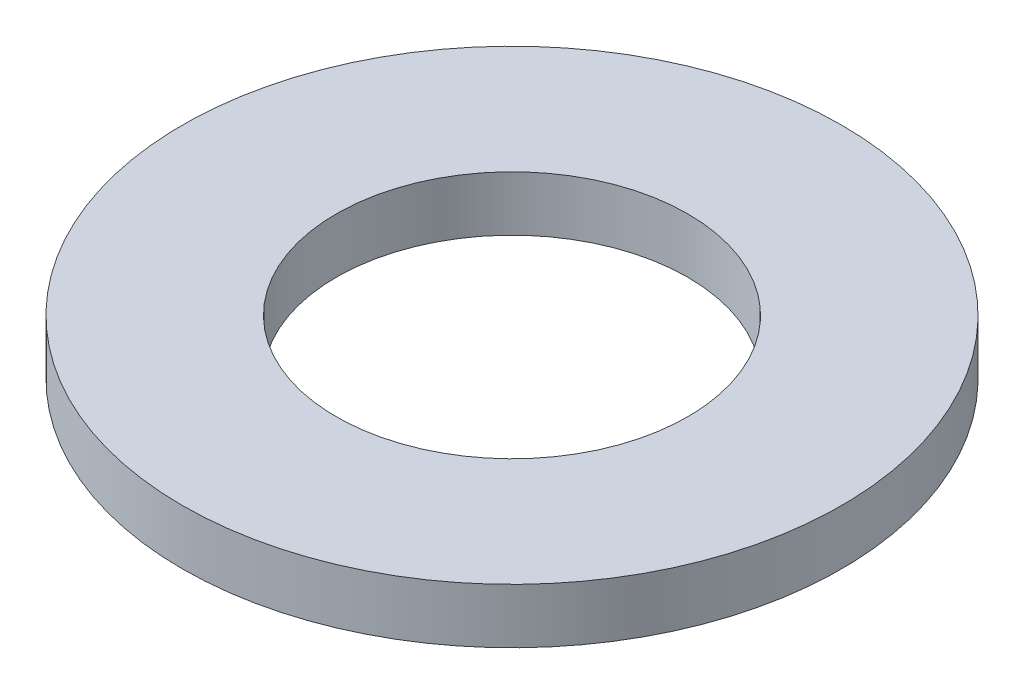
ISO-10303-21;
HEADER;
FILE_DESCRIPTION(('STEP AP214'),'2;1');
FILE_NAME('part.step','',(''),(''),'','','');
FILE_SCHEMA(('AUTOMOTIVE_DESIGN { 1 0 10303 214 1 1 1 1 }'));
ENDSEC;
DATA;
#1=APPLICATION_CONTEXT('core data for automotive mechanical design processes');
#2=APPLICATION_PROTOCOL_DEFINITION('international standard','automotive_design',2000,#1);
#3=PRODUCT_CONTEXT('',#1,'mechanical');
#4=PRODUCT('Part','Part','',(#3));
#5=PRODUCT_RELATED_PRODUCT_CATEGORY('part','',(#4));
#6=PRODUCT_DEFINITION_FORMATION('','',#4);
#7=PRODUCT_DEFINITION_CONTEXT('part definition',#1,'design');
#8=PRODUCT_DEFINITION('design','',#6,#7);
#9=PRODUCT_DEFINITION_SHAPE('','',#8);
#10=(LENGTH_UNIT() NAMED_UNIT(*) SI_UNIT(.MILLI.,.METRE.));
#11=(NAMED_UNIT(*) PLANE_ANGLE_UNIT() SI_UNIT($,.RADIAN.));
#12=(NAMED_UNIT(*) SI_UNIT($,.STERADIAN.) SOLID_ANGLE_UNIT());
#13=UNCERTAINTY_MEASURE_WITH_UNIT(LENGTH_MEASURE(1.E-05),#10,'distance_accuracy_value','');
#14=(GEOMETRIC_REPRESENTATION_CONTEXT(3) GLOBAL_UNCERTAINTY_ASSIGNED_CONTEXT((#13)) GLOBAL_UNIT_ASSIGNED_CONTEXT((#10,
#11,#12)) REPRESENTATION_CONTEXT('',''));
#15=CARTESIAN_POINT('',(0.,0.,0.));
#16=DIRECTION('',(0.,0.,1.));
#17=DIRECTION('',(1.,0.,0.));
#18=AXIS2_PLACEMENT_3D('',#15,#16,#17);
#19=CARTESIAN_POINT('',(0.,1.,0.));
#20=DIRECTION('',(0.,1.,0.));
#21=DIRECTION('',(0.,0.,-1.));
#22=AXIS2_PLACEMENT_3D('',#19,#20,#21);
#23=PLANE('',#22);
#24=CARTESIAN_POINT('',(0.,1.,0.));
#25=DIRECTION('',(0.,-1.,0.));
#26=DIRECTION('',(0.,0.,-1.));
#27=AXIS2_PLACEMENT_3D('',#24,#25,#26);
#28=CIRCLE('',#27,6.);
#29=CARTESIAN_POINT('',(0.,1.,-6.));
#30=VERTEX_POINT('',#29);
#31=EDGE_CURVE('E10',#30,#30,#28,.T.);
#32=ORIENTED_EDGE('',*,*,#31,.F.);
#33=EDGE_LOOP('',(#32));
#34=FACE_BOUND('',#33,.T.);
#35=CARTESIAN_POINT('',(0.,1.,0.));
#36=DIRECTION('',(0.,-1.,0.));
#37=DIRECTION('',(0.,0.,-1.));
#38=AXIS2_PLACEMENT_3D('',#35,#36,#37);
#39=CIRCLE('',#38,3.2);
#40=CARTESIAN_POINT('',(0.,1.,-3.2));
#41=VERTEX_POINT('',#40);
#42=EDGE_CURVE('E43',#41,#41,#39,.T.);
#43=ORIENTED_EDGE('',*,*,#42,.T.);
#44=EDGE_LOOP('',(#43));
#45=FACE_BOUND('',#44,.T.);
#46=ADVANCED_FACE('F32',(#34,#45),#23,.T.);
#47=CARTESIAN_POINT('',(0.,0.,0.));
#48=DIRECTION('',(0.,1.,0.));
#49=DIRECTION('',(0.,0.,-1.));
#50=AXIS2_PLACEMENT_3D('',#47,#48,#49);
#51=PLANE('',#50);
#52=CARTESIAN_POINT('',(0.,0.,0.));
#53=DIRECTION('',(0.,-1.,0.));
#54=DIRECTION('',(0.,0.,-1.));
#55=AXIS2_PLACEMENT_3D('',#52,#53,#54);
#56=CIRCLE('',#55,6.);
#57=CARTESIAN_POINT('',(0.,0.,-6.));
#58=VERTEX_POINT('',#57);
#59=EDGE_CURVE('E36',#58,#58,#56,.T.);
#60=ORIENTED_EDGE('',*,*,#59,.T.);
#61=EDGE_LOOP('',(#60));
#62=FACE_BOUND('',#61,.T.);
#63=CARTESIAN_POINT('',(0.,0.,0.));
#64=DIRECTION('',(0.,-1.,0.));
#65=DIRECTION('',(0.,0.,-1.));
#66=AXIS2_PLACEMENT_3D('',#63,#64,#65);
#67=CIRCLE('',#66,3.2);
#68=CARTESIAN_POINT('',(0.,0.,-3.2));
#69=VERTEX_POINT('',#68);
#70=EDGE_CURVE('E45',#69,#69,#67,.T.);
#71=ORIENTED_EDGE('',*,*,#70,.F.);
#72=EDGE_LOOP('',(#71));
#73=FACE_BOUND('',#72,.T.);
#74=ADVANCED_FACE('F58',(#62,#73),#51,.F.);
#75=CARTESIAN_POINT('',(0.,1.,0.));
#76=DIRECTION('',(0.,-1.,0.));
#77=DIRECTION('',(0.,0.,1.));
#78=AXIS2_PLACEMENT_3D('',#75,#76,#77);
#79=CYLINDRICAL_SURFACE('',#78,6.);
#80=ORIENTED_EDGE('',*,*,#31,.T.);
#81=EDGE_LOOP('',(#80));
#82=FACE_BOUND('',#81,.T.);
#83=ORIENTED_EDGE('',*,*,#59,.F.);
#84=EDGE_LOOP('',(#83));
#85=FACE_BOUND('',#84,.T.);
#86=ADVANCED_FACE('F34',(#82,#85),#79,.T.);
#87=CARTESIAN_POINT('',(0.,1.,0.));
#88=DIRECTION('',(0.,-1.,0.));
#89=DIRECTION('',(0.,0.,1.));
#90=AXIS2_PLACEMENT_3D('',#87,#88,#89);
#91=CYLINDRICAL_SURFACE('',#90,3.2);
#92=ORIENTED_EDGE('',*,*,#42,.F.);
#93=EDGE_LOOP('',(#92));
#94=FACE_BOUND('',#93,.T.);
#95=ORIENTED_EDGE('',*,*,#70,.T.);
#96=EDGE_LOOP('',(#95));
#97=FACE_BOUND('',#96,.T.);
#98=ADVANCED_FACE('F52',(#94,#97),#91,.F.);
#99=CLOSED_SHELL('',(#46,#74,#86,#98));
#100=MANIFOLD_SOLID_BREP('B2',#99);
#101=ADVANCED_BREP_SHAPE_REPRESENTATION('',(#18,#100),#14);
#102=SHAPE_DEFINITION_REPRESENTATION(#9,#101);
ENDSEC;
END-ISO-10303-21;
